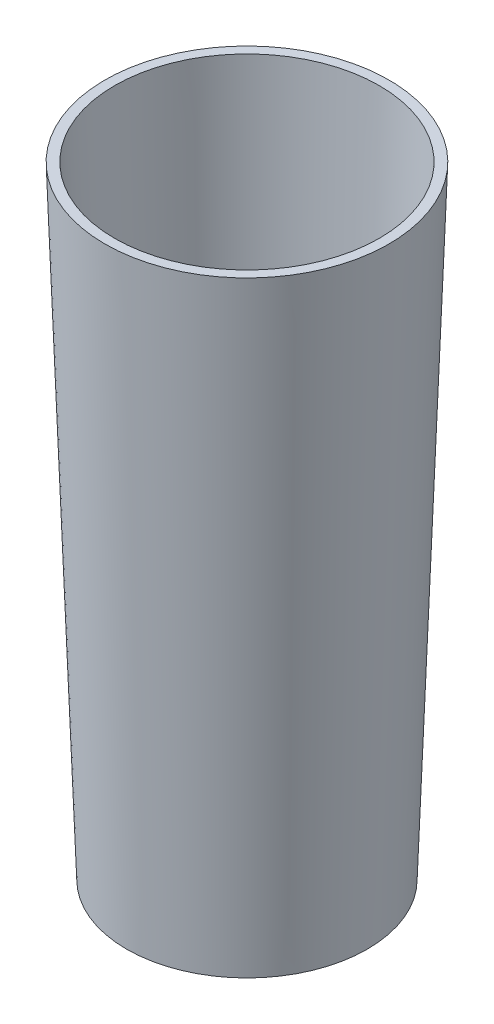
ISO-10303-21;
HEADER;
FILE_DESCRIPTION(('STEP AP214'),'2;1');
FILE_NAME('part.step','',(''),(''),'','','');
FILE_SCHEMA(('AUTOMOTIVE_DESIGN { 1 0 10303 214 1 1 1 1 }'));
ENDSEC;
DATA;
#1=APPLICATION_CONTEXT('core data for automotive mechanical design processes');
#2=APPLICATION_PROTOCOL_DEFINITION('international standard','automotive_design',2000,#1);
#3=PRODUCT_CONTEXT('',#1,'mechanical');
#4=PRODUCT('Part','Part','',(#3));
#5=PRODUCT_RELATED_PRODUCT_CATEGORY('part','',(#4));
#6=PRODUCT_DEFINITION_FORMATION('','',#4);
#7=PRODUCT_DEFINITION_CONTEXT('part definition',#1,'design');
#8=PRODUCT_DEFINITION('design','',#6,#7);
#9=PRODUCT_DEFINITION_SHAPE('','',#8);
#10=(LENGTH_UNIT() NAMED_UNIT(*) SI_UNIT(.MILLI.,.METRE.));
#11=(NAMED_UNIT(*) PLANE_ANGLE_UNIT() SI_UNIT($,.RADIAN.));
#12=(NAMED_UNIT(*) SI_UNIT($,.STERADIAN.) SOLID_ANGLE_UNIT());
#13=UNCERTAINTY_MEASURE_WITH_UNIT(LENGTH_MEASURE(1.E-05),#10,'distance_accuracy_value','');
#14=(GEOMETRIC_REPRESENTATION_CONTEXT(3) GLOBAL_UNCERTAINTY_ASSIGNED_CONTEXT((#13)) GLOBAL_UNIT_ASSIGNED_CONTEXT((#10,
#11,#12)) REPRESENTATION_CONTEXT('',''));
#15=CARTESIAN_POINT('',(0.,0.,0.));
#16=DIRECTION('',(0.,0.,1.));
#17=DIRECTION('',(1.,0.,0.));
#18=AXIS2_PLACEMENT_3D('',#15,#16,#17);
#19=CARTESIAN_POINT('',(0.,0.,0.));
#20=DIRECTION('',(0.,1.,0.));
#21=DIRECTION('',(0.,0.,1.));
#22=AXIS2_PLACEMENT_3D('',#19,#20,#21);
#23=CONICAL_SURFACE('',#22,6.195,0.0349065850398867);
#24=CARTESIAN_POINT('',(0.,32.,0.));
#25=DIRECTION('',(0.,1.,0.));
#26=DIRECTION('',(0.,0.,1.));
#27=AXIS2_PLACEMENT_3D('',#24,#25,#26);
#28=CIRCLE('',#27,7.31246462373593);
#29=CARTESIAN_POINT('',(0.,32.,7.31246462373593));
#30=VERTEX_POINT('',#29);
#31=EDGE_CURVE('E10',#30,#30,#28,.T.);
#32=ORIENTED_EDGE('',*,*,#31,.F.);
#33=EDGE_LOOP('',(#32));
#34=FACE_BOUND('',#33,.T.);
#35=CARTESIAN_POINT('',(0.,0.,0.));
#36=DIRECTION('',(0.,1.,0.));
#37=DIRECTION('',(0.,0.,1.));
#38=AXIS2_PLACEMENT_3D('',#35,#36,#37);
#39=CIRCLE('',#38,6.195);
#40=CARTESIAN_POINT('',(0.,0.,6.195));
#41=VERTEX_POINT('',#40);
#42=EDGE_CURVE('E48',#41,#41,#39,.T.);
#43=ORIENTED_EDGE('',*,*,#42,.T.);
#44=EDGE_LOOP('',(#43));
#45=FACE_BOUND('',#44,.T.);
#46=ADVANCED_FACE('F41',(#34,#45),#23,.T.);
#47=CARTESIAN_POINT('',(0.,32.,0.));
#48=DIRECTION('',(0.,1.,0.));
#49=DIRECTION('',(0.,0.,1.));
#50=AXIS2_PLACEMENT_3D('',#47,#48,#49);
#51=PLANE('',#50);
#52=CARTESIAN_POINT('',(0.,32.,0.));
#53=DIRECTION('',(0.,1.,0.));
#54=DIRECTION('',(0.,0.,1.));
#55=AXIS2_PLACEMENT_3D('',#52,#53,#54);
#56=CIRCLE('',#55,6.81246462373593);
#57=CARTESIAN_POINT('',(0.,32.,6.81246462373593));
#58=VERTEX_POINT('',#57);
#59=EDGE_CURVE('E53',#58,#58,#56,.T.);
#60=ORIENTED_EDGE('',*,*,#59,.F.);
#61=EDGE_LOOP('',(#60));
#62=FACE_BOUND('',#61,.T.);
#63=ORIENTED_EDGE('',*,*,#31,.T.);
#64=EDGE_LOOP('',(#63));
#65=FACE_BOUND('',#64,.T.);
#66=ADVANCED_FACE('F70',(#62,#65),#51,.T.);
#67=CARTESIAN_POINT('',(0.,0.,0.));
#68=DIRECTION('',(0.,1.,0.));
#69=DIRECTION('',(0.,0.,1.));
#70=AXIS2_PLACEMENT_3D('',#67,#68,#69);
#71=PLANE('',#70);
#72=CARTESIAN_POINT('',(0.,0.,0.));
#73=DIRECTION('',(0.,-1.,0.));
#74=DIRECTION('',(0.,0.,-1.));
#75=AXIS2_PLACEMENT_3D('',#72,#73,#74);
#76=CIRCLE('',#75,5.695);
#77=CARTESIAN_POINT('',(0.,0.,-5.695));
#78=VERTEX_POINT('',#77);
#79=EDGE_CURVE('E58',#78,#78,#76,.T.);
#80=ORIENTED_EDGE('',*,*,#79,.F.);
#81=EDGE_LOOP('',(#80));
#82=FACE_BOUND('',#81,.T.);
#83=ORIENTED_EDGE('',*,*,#42,.F.);
#84=EDGE_LOOP('',(#83));
#85=FACE_BOUND('',#84,.T.);
#86=ADVANCED_FACE('F67',(#82,#85),#71,.F.);
#87=CARTESIAN_POINT('',(0.,0.,0.));
#88=DIRECTION('',(0.,1.,0.));
#89=DIRECTION('',(0.,0.,-1.));
#90=AXIS2_PLACEMENT_3D('',#87,#88,#89);
#91=CONICAL_SURFACE('',#90,5.695,0.0349065850398867);
#92=ORIENTED_EDGE('',*,*,#59,.T.);
#93=EDGE_LOOP('',(#92));
#94=FACE_BOUND('',#93,.T.);
#95=ORIENTED_EDGE('',*,*,#79,.T.);
#96=EDGE_LOOP('',(#95));
#97=FACE_BOUND('',#96,.T.);
#98=ADVANCED_FACE('F65',(#94,#97),#91,.F.);
#99=CLOSED_SHELL('',(#46,#66,#86,#98));
#100=MANIFOLD_SOLID_BREP('B2',#99);
#101=ADVANCED_BREP_SHAPE_REPRESENTATION('',(#18,#100),#14);
#102=SHAPE_DEFINITION_REPRESENTATION(#9,#101);
ENDSEC;
END-ISO-10303-21;
